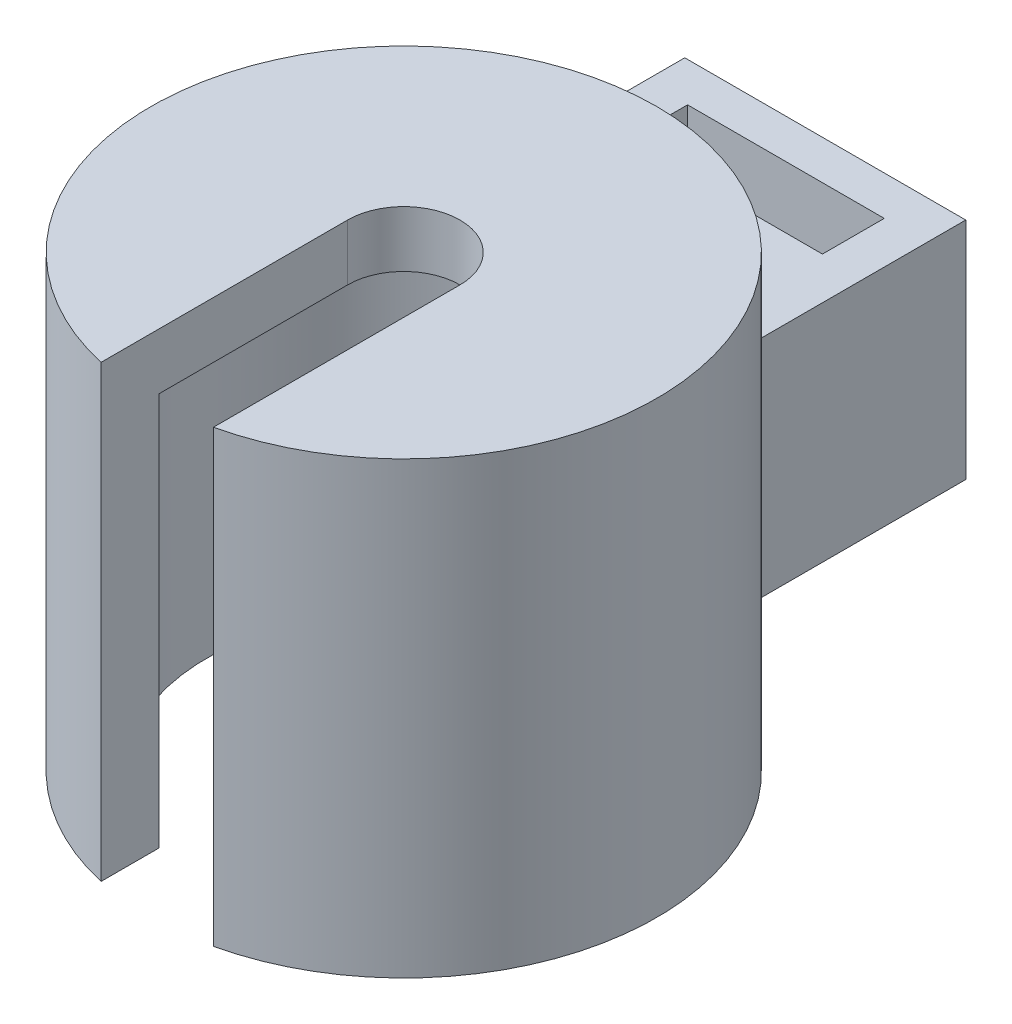
ISO-10303-21;
HEADER;
FILE_DESCRIPTION(('STEP AP214'),'2;1');
FILE_NAME('part.step','',(''),(''),'','','');
FILE_SCHEMA(('AUTOMOTIVE_DESIGN { 1 0 10303 214 1 1 1 1 }'));
ENDSEC;
DATA;
#1=APPLICATION_CONTEXT('core data for automotive mechanical design processes');
#2=APPLICATION_PROTOCOL_DEFINITION('international standard','automotive_design',2000,#1);
#3=PRODUCT_CONTEXT('',#1,'mechanical');
#4=PRODUCT('Part','Part','',(#3));
#5=PRODUCT_RELATED_PRODUCT_CATEGORY('part','',(#4));
#6=PRODUCT_DEFINITION_FORMATION('','',#4);
#7=PRODUCT_DEFINITION_CONTEXT('part definition',#1,'design');
#8=PRODUCT_DEFINITION('design','',#6,#7);
#9=PRODUCT_DEFINITION_SHAPE('','',#8);
#10=(LENGTH_UNIT() NAMED_UNIT(*) SI_UNIT(.MILLI.,.METRE.));
#11=(NAMED_UNIT(*) PLANE_ANGLE_UNIT() SI_UNIT($,.RADIAN.));
#12=(NAMED_UNIT(*) SI_UNIT($,.STERADIAN.) SOLID_ANGLE_UNIT());
#13=UNCERTAINTY_MEASURE_WITH_UNIT(LENGTH_MEASURE(1.E-05),#10,'distance_accuracy_value','');
#14=(GEOMETRIC_REPRESENTATION_CONTEXT(3) GLOBAL_UNCERTAINTY_ASSIGNED_CONTEXT((#13)) GLOBAL_UNIT_ASSIGNED_CONTEXT((#10,
#11,#12)) REPRESENTATION_CONTEXT('',''));
#15=CARTESIAN_POINT('',(0.,0.,0.));
#16=DIRECTION('',(0.,0.,1.));
#17=DIRECTION('',(1.,0.,0.));
#18=AXIS2_PLACEMENT_3D('',#15,#16,#17);
#19=CARTESIAN_POINT('',(0.,7.,0.));
#20=DIRECTION('',(0.,-1.,0.));
#21=DIRECTION('',(0.,0.,-1.));
#22=AXIS2_PLACEMENT_3D('',#19,#20,#21);
#23=CYLINDRICAL_SURFACE('',#22,4.5);
#24=CARTESIAN_POINT('',(0.,0.,0.));
#25=DIRECTION('',(0.,1.,0.));
#26=DIRECTION('',(0.,0.,1.));
#27=AXIS2_PLACEMENT_3D('',#24,#25,#26);
#28=CIRCLE('',#27,4.5);
#29=CARTESIAN_POINT('',(1.,0.,4.38748219369606));
#30=VERTEX_POINT('',#29);
#31=CARTESIAN_POINT('',(-1.,0.,4.38748219369606));
#32=VERTEX_POINT('',#31);
#33=EDGE_CURVE('E268',#30,#32,#28,.T.);
#34=ORIENTED_EDGE('',*,*,#33,.T.);
#35=DIRECTION('',(0.,-1.,0.));
#36=VECTOR('',#35,1.);
#37=CARTESIAN_POINT('',(-1.,7.,4.38748219369606));
#38=LINE('',#37,#36);
#39=CARTESIAN_POINT('',(-1.,8.,4.38748219369606));
#40=VERTEX_POINT('',#39);
#41=EDGE_CURVE('E284',#40,#32,#38,.T.);
#42=ORIENTED_EDGE('',*,*,#41,.F.);
#43=CARTESIAN_POINT('',(0.,8.,0.));
#44=DIRECTION('',(0.,1.,0.));
#45=DIRECTION('',(0.,0.,1.));
#46=AXIS2_PLACEMENT_3D('',#43,#44,#45);
#47=CIRCLE('',#46,4.5);
#48=CARTESIAN_POINT('',(1.,8.,4.38748219369606));
#49=VERTEX_POINT('',#48);
#50=EDGE_CURVE('E235',#49,#40,#47,.T.);
#51=ORIENTED_EDGE('',*,*,#50,.F.);
#52=DIRECTION('',(0.,-1.,0.));
#53=VECTOR('',#52,1.);
#54=CARTESIAN_POINT('',(1.,7.,4.38748219369606));
#55=LINE('',#54,#53);
#56=EDGE_CURVE('E287',#49,#30,#55,.T.);
#57=ORIENTED_EDGE('',*,*,#56,.T.);
#58=EDGE_LOOP('',(#34,#42,#51,#57));
#59=FACE_BOUND('',#58,.T.);
#60=DIRECTION('',(0.,-1.,0.));
#61=VECTOR('',#60,1.);
#62=CARTESIAN_POINT('',(-2.5,7.,-3.74165738677394));
#63=LINE('',#62,#61);
#64=CARTESIAN_POINT('',(-2.5,2.,-3.74165738677394));
#65=VERTEX_POINT('',#64);
#66=CARTESIAN_POINT('',(-2.5,6.,-3.74165738677394));
#67=VERTEX_POINT('',#66);
#68=EDGE_CURVE('E11',#65,#67,#63,.F.);
#69=ORIENTED_EDGE('',*,*,#68,.F.);
#70=CARTESIAN_POINT('',(0.,2.,0.));
#71=DIRECTION('',(0.,-1.,0.));
#72=DIRECTION('',(0.,0.,-1.));
#73=AXIS2_PLACEMENT_3D('',#70,#71,#72);
#74=CIRCLE('',#73,4.5);
#75=CARTESIAN_POINT('',(2.5,2.,-3.74165738677394));
#76=VERTEX_POINT('',#75);
#77=EDGE_CURVE('E221',#65,#76,#74,.T.);
#78=ORIENTED_EDGE('',*,*,#77,.T.);
#79=DIRECTION('',(0.,-1.,0.));
#80=VECTOR('',#79,1.);
#81=CARTESIAN_POINT('',(2.5,7.,-3.74165738677394));
#82=LINE('',#81,#80);
#83=CARTESIAN_POINT('',(2.5,6.,-3.74165738677394));
#84=VERTEX_POINT('',#83);
#85=EDGE_CURVE('E50',#76,#84,#82,.F.);
#86=ORIENTED_EDGE('',*,*,#85,.T.);
#87=CARTESIAN_POINT('',(0.,6.,0.));
#88=DIRECTION('',(0.,-1.,0.));
#89=DIRECTION('',(0.,0.,-1.));
#90=AXIS2_PLACEMENT_3D('',#87,#88,#89);
#91=CIRCLE('',#90,4.5);
#92=EDGE_CURVE('E214',#67,#84,#91,.T.);
#93=ORIENTED_EDGE('',*,*,#92,.F.);
#94=EDGE_LOOP('',(#69,#78,#86,#93));
#95=FACE_BOUND('',#94,.T.);
#96=ADVANCED_FACE('F41',(#59,#95),#23,.T.);
#97=CARTESIAN_POINT('',(1.,7.,0.));
#98=DIRECTION('',(1.,0.,0.));
#99=DIRECTION('',(0.,0.,-1.));
#100=AXIS2_PLACEMENT_3D('',#97,#98,#99);
#101=PLANE('',#100);
#102=DIRECTION('',(0.,0.,1.));
#103=VECTOR('',#102,1.);
#104=CARTESIAN_POINT('',(1.,0.,0.));
#105=LINE('',#104,#103);
#106=CARTESIAN_POINT('',(1.,0.,3.35410196624968));
#107=VERTEX_POINT('',#106);
#108=EDGE_CURVE('E258',#107,#30,#105,.T.);
#109=ORIENTED_EDGE('',*,*,#108,.T.);
#110=ORIENTED_EDGE('',*,*,#56,.F.);
#111=DIRECTION('',(0.,0.,1.));
#112=VECTOR('',#111,1.);
#113=CARTESIAN_POINT('',(1.,8.,0.));
#114=LINE('',#113,#112);
#115=CARTESIAN_POINT('',(1.,8.,0.));
#116=VERTEX_POINT('',#115);
#117=EDGE_CURVE('E230',#116,#49,#114,.T.);
#118=ORIENTED_EDGE('',*,*,#117,.F.);
#119=DIRECTION('',(0.,-1.,0.));
#120=VECTOR('',#119,1.);
#121=CARTESIAN_POINT('',(1.,8.,0.));
#122=LINE('',#121,#120);
#123=CARTESIAN_POINT('',(1.,7.,0.));
#124=VERTEX_POINT('',#123);
#125=EDGE_CURVE('E255',#116,#124,#122,.T.);
#126=ORIENTED_EDGE('',*,*,#125,.T.);
#127=DIRECTION('',(0.,0.,1.));
#128=VECTOR('',#127,1.);
#129=CARTESIAN_POINT('',(1.,7.,0.));
#130=LINE('',#129,#128);
#131=CARTESIAN_POINT('',(1.,7.,3.35410196624968));
#132=VERTEX_POINT('',#131);
#133=EDGE_CURVE('E247',#124,#132,#130,.T.);
#134=ORIENTED_EDGE('',*,*,#133,.T.);
#135=DIRECTION('',(0.,-1.,0.));
#136=VECTOR('',#135,1.);
#137=CARTESIAN_POINT('',(1.,7.,3.35410196624968));
#138=LINE('',#137,#136);
#139=EDGE_CURVE('E263',#132,#107,#138,.T.);
#140=ORIENTED_EDGE('',*,*,#139,.T.);
#141=EDGE_LOOP('',(#109,#110,#118,#126,#134,#140));
#142=FACE_BOUND('',#141,.T.);
#143=ADVANCED_FACE('F43',(#142),#101,.F.);
#144=CARTESIAN_POINT('',(-1.,7.,0.));
#145=DIRECTION('',(1.,0.,0.));
#146=DIRECTION('',(0.,0.,-1.));
#147=AXIS2_PLACEMENT_3D('',#144,#145,#146);
#148=PLANE('',#147);
#149=DIRECTION('',(0.,0.,1.));
#150=VECTOR('',#149,1.);
#151=CARTESIAN_POINT('',(-1.,0.,0.));
#152=LINE('',#151,#150);
#153=CARTESIAN_POINT('',(-1.,0.,3.35410196624968));
#154=VERTEX_POINT('',#153);
#155=EDGE_CURVE('E272',#154,#32,#152,.T.);
#156=ORIENTED_EDGE('',*,*,#155,.F.);
#157=DIRECTION('',(0.,-1.,0.));
#158=VECTOR('',#157,1.);
#159=CARTESIAN_POINT('',(-1.,7.,3.35410196624968));
#160=LINE('',#159,#158);
#161=CARTESIAN_POINT('',(-1.,7.,3.35410196624968));
#162=VERTEX_POINT('',#161);
#163=EDGE_CURVE('E281',#162,#154,#160,.T.);
#164=ORIENTED_EDGE('',*,*,#163,.F.);
#165=DIRECTION('',(0.,0.,1.));
#166=VECTOR('',#165,1.);
#167=CARTESIAN_POINT('',(-1.,7.,0.));
#168=LINE('',#167,#166);
#169=CARTESIAN_POINT('',(-1.,7.,0.));
#170=VERTEX_POINT('',#169);
#171=EDGE_CURVE('E231',#170,#162,#168,.T.);
#172=ORIENTED_EDGE('',*,*,#171,.F.);
#173=DIRECTION('',(0.,-1.,0.));
#174=VECTOR('',#173,1.);
#175=CARTESIAN_POINT('',(-1.,8.,0.));
#176=LINE('',#175,#174);
#177=CARTESIAN_POINT('',(-1.,8.,0.));
#178=VERTEX_POINT('',#177);
#179=EDGE_CURVE('E243',#178,#170,#176,.T.);
#180=ORIENTED_EDGE('',*,*,#179,.F.);
#181=DIRECTION('',(0.,0.,1.));
#182=VECTOR('',#181,1.);
#183=CARTESIAN_POINT('',(-1.,8.,0.));
#184=LINE('',#183,#182);
#185=EDGE_CURVE('E239',#178,#40,#184,.T.);
#186=ORIENTED_EDGE('',*,*,#185,.T.);
#187=ORIENTED_EDGE('',*,*,#41,.T.);
#188=EDGE_LOOP('',(#156,#164,#172,#180,#186,#187));
#189=FACE_BOUND('',#188,.T.);
#190=ADVANCED_FACE('F327',(#189),#148,.T.);
#191=CARTESIAN_POINT('',(0.,7.,0.));
#192=DIRECTION('',(0.,-1.,0.));
#193=DIRECTION('',(0.,0.,-1.));
#194=AXIS2_PLACEMENT_3D('',#191,#192,#193);
#195=CYLINDRICAL_SURFACE('',#194,3.5);
#196=CARTESIAN_POINT('',(0.,0.,0.));
#197=DIRECTION('',(0.,1.,0.));
#198=DIRECTION('',(0.,0.,1.));
#199=AXIS2_PLACEMENT_3D('',#196,#197,#198);
#200=CIRCLE('',#199,3.5);
#201=EDGE_CURVE('E264',#107,#154,#200,.T.);
#202=ORIENTED_EDGE('',*,*,#201,.F.);
#203=ORIENTED_EDGE('',*,*,#139,.F.);
#204=CARTESIAN_POINT('',(0.,7.,0.));
#205=DIRECTION('',(0.,1.,0.));
#206=DIRECTION('',(0.,0.,1.));
#207=AXIS2_PLACEMENT_3D('',#204,#205,#206);
#208=CIRCLE('',#207,3.5);
#209=EDGE_CURVE('E259',#132,#162,#208,.T.);
#210=ORIENTED_EDGE('',*,*,#209,.T.);
#211=ORIENTED_EDGE('',*,*,#163,.T.);
#212=EDGE_LOOP('',(#202,#203,#210,#211));
#213=FACE_BOUND('',#212,.T.);
#214=ADVANCED_FACE('F332',(#213),#195,.F.);
#215=CARTESIAN_POINT('',(0.,0.,0.));
#216=DIRECTION('',(0.,1.,0.));
#217=DIRECTION('',(0.,0.,1.));
#218=AXIS2_PLACEMENT_3D('',#215,#216,#217);
#219=PLANE('',#218);
#220=ORIENTED_EDGE('',*,*,#108,.F.);
#221=ORIENTED_EDGE('',*,*,#201,.T.);
#222=ORIENTED_EDGE('',*,*,#155,.T.);
#223=ORIENTED_EDGE('',*,*,#33,.F.);
#224=EDGE_LOOP('',(#220,#221,#222,#223));
#225=FACE_BOUND('',#224,.T.);
#226=ADVANCED_FACE('F336',(#225),#219,.F.);
#227=CARTESIAN_POINT('',(0.,7.,0.));
#228=DIRECTION('',(0.,1.,0.));
#229=DIRECTION('',(0.,0.,1.));
#230=AXIS2_PLACEMENT_3D('',#227,#228,#229);
#231=PLANE('',#230);
#232=ORIENTED_EDGE('',*,*,#209,.F.);
#233=ORIENTED_EDGE('',*,*,#133,.F.);
#234=CARTESIAN_POINT('',(0.,7.,0.));
#235=DIRECTION('',(0.,1.,0.));
#236=DIRECTION('',(0.,0.,1.));
#237=AXIS2_PLACEMENT_3D('',#234,#235,#236);
#238=CIRCLE('',#237,1.);
#239=EDGE_CURVE('E225',#124,#170,#238,.T.);
#240=ORIENTED_EDGE('',*,*,#239,.T.);
#241=ORIENTED_EDGE('',*,*,#171,.T.);
#242=EDGE_LOOP('',(#232,#233,#240,#241));
#243=FACE_BOUND('',#242,.T.);
#244=ADVANCED_FACE('F340',(#243),#231,.F.);
#245=CARTESIAN_POINT('',(0.,8.,0.));
#246=DIRECTION('',(0.,-1.,0.));
#247=DIRECTION('',(0.,0.,-1.));
#248=AXIS2_PLACEMENT_3D('',#245,#246,#247);
#249=CYLINDRICAL_SURFACE('',#248,1.);
#250=ORIENTED_EDGE('',*,*,#239,.F.);
#251=ORIENTED_EDGE('',*,*,#125,.F.);
#252=CARTESIAN_POINT('',(0.,8.,0.));
#253=DIRECTION('',(0.,1.,0.));
#254=DIRECTION('',(0.,0.,1.));
#255=AXIS2_PLACEMENT_3D('',#252,#253,#254);
#256=CIRCLE('',#255,1.);
#257=EDGE_CURVE('E226',#116,#178,#256,.T.);
#258=ORIENTED_EDGE('',*,*,#257,.T.);
#259=ORIENTED_EDGE('',*,*,#179,.T.);
#260=EDGE_LOOP('',(#250,#251,#258,#259));
#261=FACE_BOUND('',#260,.T.);
#262=ADVANCED_FACE('F318',(#261),#249,.F.);
#263=CARTESIAN_POINT('',(0.,8.,0.));
#264=DIRECTION('',(0.,1.,0.));
#265=DIRECTION('',(0.,0.,1.));
#266=AXIS2_PLACEMENT_3D('',#263,#264,#265);
#267=PLANE('',#266);
#268=ORIENTED_EDGE('',*,*,#257,.F.);
#269=ORIENTED_EDGE('',*,*,#117,.T.);
#270=ORIENTED_EDGE('',*,*,#50,.T.);
#271=ORIENTED_EDGE('',*,*,#185,.F.);
#272=EDGE_LOOP('',(#268,#269,#270,#271));
#273=FACE_BOUND('',#272,.T.);
#274=ADVANCED_FACE('F311',(#273),#267,.T.);
#275=CARTESIAN_POINT('',(-2.5,0.,0.));
#276=DIRECTION('',(1.,0.,0.));
#277=DIRECTION('',(0.,0.,-1.));
#278=AXIS2_PLACEMENT_3D('',#275,#276,#277);
#279=PLANE('',#278);
#280=DIRECTION('',(0.,0.,-1.));
#281=VECTOR('',#280,1.);
#282=CARTESIAN_POINT('',(-2.5,2.,0.));
#283=LINE('',#282,#281);
#284=CARTESIAN_POINT('',(-2.5,2.,-7.5));
#285=VERTEX_POINT('',#284);
#286=EDGE_CURVE('E206',#65,#285,#283,.T.);
#287=ORIENTED_EDGE('',*,*,#286,.F.);
#288=ORIENTED_EDGE('',*,*,#68,.T.);
#289=DIRECTION('',(0.,0.,-1.));
#290=VECTOR('',#289,1.);
#291=CARTESIAN_POINT('',(-2.5,6.,0.));
#292=LINE('',#291,#290);
#293=CARTESIAN_POINT('',(-2.5,6.,-7.5));
#294=VERTEX_POINT('',#293);
#295=EDGE_CURVE('E203',#67,#294,#292,.T.);
#296=ORIENTED_EDGE('',*,*,#295,.T.);
#297=DIRECTION('',(0.,-1.,0.));
#298=VECTOR('',#297,1.);
#299=CARTESIAN_POINT('',(-2.5,0.,-7.5));
#300=LINE('',#299,#298);
#301=EDGE_CURVE('E199',#294,#285,#300,.T.);
#302=ORIENTED_EDGE('',*,*,#301,.T.);
#303=EDGE_LOOP('',(#287,#288,#296,#302));
#304=FACE_BOUND('',#303,.T.);
#305=ADVANCED_FACE('F309',(#304),#279,.F.);
#306=CARTESIAN_POINT('',(2.5,0.,0.));
#307=DIRECTION('',(1.,0.,0.));
#308=DIRECTION('',(0.,0.,-1.));
#309=AXIS2_PLACEMENT_3D('',#306,#307,#308);
#310=PLANE('',#309);
#311=ORIENTED_EDGE('',*,*,#85,.F.);
#312=DIRECTION('',(0.,0.,-1.));
#313=VECTOR('',#312,1.);
#314=CARTESIAN_POINT('',(2.5,2.,0.));
#315=LINE('',#314,#313);
#316=CARTESIAN_POINT('',(2.5,2.,-7.5));
#317=VERTEX_POINT('',#316);
#318=EDGE_CURVE('E196',#76,#317,#315,.T.);
#319=ORIENTED_EDGE('',*,*,#318,.T.);
#320=DIRECTION('',(0.,-1.,0.));
#321=VECTOR('',#320,1.);
#322=CARTESIAN_POINT('',(2.5,0.,-7.5));
#323=LINE('',#322,#321);
#324=CARTESIAN_POINT('',(2.5,6.,-7.5));
#325=VERTEX_POINT('',#324);
#326=EDGE_CURVE('E189',#325,#317,#323,.T.);
#327=ORIENTED_EDGE('',*,*,#326,.F.);
#328=DIRECTION('',(0.,0.,-1.));
#329=VECTOR('',#328,1.);
#330=CARTESIAN_POINT('',(2.5,6.,0.));
#331=LINE('',#330,#329);
#332=EDGE_CURVE('E193',#84,#325,#331,.T.);
#333=ORIENTED_EDGE('',*,*,#332,.F.);
#334=EDGE_LOOP('',(#311,#319,#327,#333));
#335=FACE_BOUND('',#334,.T.);
#336=ADVANCED_FACE('F297',(#335),#310,.T.);
#337=CARTESIAN_POINT('',(-2.5,0.,-7.5));
#338=DIRECTION('',(0.,0.,1.));
#339=DIRECTION('',(0.,-1.,0.));
#340=AXIS2_PLACEMENT_3D('',#337,#338,#339);
#341=PLANE('',#340);
#342=DIRECTION('',(1.,0.,0.));
#343=VECTOR('',#342,1.);
#344=CARTESIAN_POINT('',(-2.5,6.,-7.5));
#345=LINE('',#344,#343);
#346=EDGE_CURVE('E209',#294,#325,#345,.T.);
#347=ORIENTED_EDGE('',*,*,#346,.T.);
#348=ORIENTED_EDGE('',*,*,#326,.T.);
#349=DIRECTION('',(1.,0.,0.));
#350=VECTOR('',#349,1.);
#351=CARTESIAN_POINT('',(-2.5,2.,-7.5));
#352=LINE('',#351,#350);
#353=EDGE_CURVE('E210',#285,#317,#352,.T.);
#354=ORIENTED_EDGE('',*,*,#353,.F.);
#355=ORIENTED_EDGE('',*,*,#301,.F.);
#356=EDGE_LOOP('',(#347,#348,#354,#355));
#357=FACE_BOUND('',#356,.T.);
#358=ADVANCED_FACE('F305',(#357),#341,.F.);
#359=CARTESIAN_POINT('',(-2.5,2.,0.));
#360=DIRECTION('',(0.,-1.,0.));
#361=DIRECTION('',(0.,0.,-1.));
#362=AXIS2_PLACEMENT_3D('',#359,#360,#361);
#363=PLANE('',#362);
#364=DIRECTION('',(1.,0.,0.));
#365=VECTOR('',#364,1.);
#366=CARTESIAN_POINT('',(-2.5,2.,-6.80000000000001));
#367=LINE('',#366,#365);
#368=CARTESIAN_POINT('',(-1.75,2.,-6.80000000000001));
#369=VERTEX_POINT('',#368);
#370=CARTESIAN_POINT('',(1.75,2.,-6.80000000000001));
#371=VERTEX_POINT('',#370);
#372=EDGE_CURVE('E186',#369,#371,#367,.T.);
#373=ORIENTED_EDGE('',*,*,#372,.F.);
#374=DIRECTION('',(0.,0.,-1.));
#375=VECTOR('',#374,1.);
#376=CARTESIAN_POINT('',(-1.75,2.,0.));
#377=LINE('',#376,#375);
#378=CARTESIAN_POINT('',(-1.75,2.,-5.70000000000001));
#379=VERTEX_POINT('',#378);
#380=EDGE_CURVE('E173',#379,#369,#377,.T.);
#381=ORIENTED_EDGE('',*,*,#380,.F.);
#382=DIRECTION('',(1.,0.,0.));
#383=VECTOR('',#382,1.);
#384=CARTESIAN_POINT('',(-2.5,2.,-5.70000000000001));
#385=LINE('',#384,#383);
#386=CARTESIAN_POINT('',(1.75,2.,-5.70000000000001));
#387=VERTEX_POINT('',#386);
#388=EDGE_CURVE('E148',#379,#387,#385,.T.);
#389=ORIENTED_EDGE('',*,*,#388,.T.);
#390=DIRECTION('',(0.,0.,-1.));
#391=VECTOR('',#390,1.);
#392=CARTESIAN_POINT('',(1.75,2.,0.));
#393=LINE('',#392,#391);
#394=EDGE_CURVE('E182',#387,#371,#393,.T.);
#395=ORIENTED_EDGE('',*,*,#394,.T.);
#396=EDGE_LOOP('',(#373,#381,#389,#395));
#397=FACE_BOUND('',#396,.T.);
#398=ORIENTED_EDGE('',*,*,#77,.F.);
#399=ORIENTED_EDGE('',*,*,#286,.T.);
#400=ORIENTED_EDGE('',*,*,#353,.T.);
#401=ORIENTED_EDGE('',*,*,#318,.F.);
#402=EDGE_LOOP('',(#398,#399,#400,#401));
#403=FACE_BOUND('',#402,.T.);
#404=ADVANCED_FACE('F300',(#397,#403),#363,.T.);
#405=CARTESIAN_POINT('',(-2.5,6.,0.));
#406=DIRECTION('',(0.,-1.,0.));
#407=DIRECTION('',(0.,0.,-1.));
#408=AXIS2_PLACEMENT_3D('',#405,#406,#407);
#409=PLANE('',#408);
#410=DIRECTION('',(0.,0.,1.));
#411=VECTOR('',#410,1.);
#412=CARTESIAN_POINT('',(-1.75,6.,0.));
#413=LINE('',#412,#411);
#414=CARTESIAN_POINT('',(-1.75,6.,-6.80000000000001));
#415=VERTEX_POINT('',#414);
#416=CARTESIAN_POINT('',(-1.75,6.,-5.70000000000001));
#417=VERTEX_POINT('',#416);
#418=EDGE_CURVE('E155',#415,#417,#413,.T.);
#419=ORIENTED_EDGE('',*,*,#418,.F.);
#420=DIRECTION('',(-1.,0.,0.));
#421=VECTOR('',#420,1.);
#422=CARTESIAN_POINT('',(0.,6.,-6.80000000000001));
#423=LINE('',#422,#421);
#424=CARTESIAN_POINT('',(1.75,6.,-6.80000000000001));
#425=VERTEX_POINT('',#424);
#426=EDGE_CURVE('E65',#425,#415,#423,.T.);
#427=ORIENTED_EDGE('',*,*,#426,.F.);
#428=DIRECTION('',(0.,0.,1.));
#429=VECTOR('',#428,1.);
#430=CARTESIAN_POINT('',(1.75,6.,0.));
#431=LINE('',#430,#429);
#432=CARTESIAN_POINT('',(1.75,6.,-5.70000000000001));
#433=VERTEX_POINT('',#432);
#434=EDGE_CURVE('E163',#425,#433,#431,.T.);
#435=ORIENTED_EDGE('',*,*,#434,.T.);
#436=DIRECTION('',(-1.,0.,0.));
#437=VECTOR('',#436,1.);
#438=CARTESIAN_POINT('',(0.,6.,-5.70000000000001));
#439=LINE('',#438,#437);
#440=EDGE_CURVE('E145',#433,#417,#439,.T.);
#441=ORIENTED_EDGE('',*,*,#440,.T.);
#442=EDGE_LOOP('',(#419,#427,#435,#441));
#443=FACE_BOUND('',#442,.T.);
#444=ORIENTED_EDGE('',*,*,#295,.F.);
#445=ORIENTED_EDGE('',*,*,#92,.T.);
#446=ORIENTED_EDGE('',*,*,#332,.T.);
#447=ORIENTED_EDGE('',*,*,#346,.F.);
#448=EDGE_LOOP('',(#444,#445,#446,#447));
#449=FACE_BOUND('',#448,.T.);
#450=ADVANCED_FACE('F160',(#443,#449),#409,.F.);
#451=CARTESIAN_POINT('',(0.,-1.,-6.80000000000001));
#452=DIRECTION('',(0.,0.,-1.));
#453=DIRECTION('',(-1.,0.,0.));
#454=AXIS2_PLACEMENT_3D('',#451,#452,#453);
#455=PLANE('',#454);
#456=ORIENTED_EDGE('',*,*,#372,.T.);
#457=DIRECTION('',(0.,1.,0.));
#458=VECTOR('',#457,1.);
#459=CARTESIAN_POINT('',(1.75,-1.,-6.80000000000001));
#460=LINE('',#459,#458);
#461=EDGE_CURVE('E170',#371,#425,#460,.T.);
#462=ORIENTED_EDGE('',*,*,#461,.T.);
#463=ORIENTED_EDGE('',*,*,#426,.T.);
#464=DIRECTION('',(0.,1.,0.));
#465=VECTOR('',#464,1.);
#466=CARTESIAN_POINT('',(-1.75,-1.,-6.80000000000001));
#467=LINE('',#466,#465);
#468=EDGE_CURVE('E152',#369,#415,#467,.T.);
#469=ORIENTED_EDGE('',*,*,#468,.F.);
#470=EDGE_LOOP('',(#456,#462,#463,#469));
#471=FACE_BOUND('',#470,.T.);
#472=ADVANCED_FACE('F351',(#471),#455,.F.);
#473=CARTESIAN_POINT('',(1.75,-1.,0.));
#474=DIRECTION('',(-1.,0.,0.));
#475=DIRECTION('',(0.,0.,1.));
#476=AXIS2_PLACEMENT_3D('',#473,#474,#475);
#477=PLANE('',#476);
#478=DIRECTION('',(0.,1.,0.));
#479=VECTOR('',#478,1.);
#480=CARTESIAN_POINT('',(1.75,-1.,-5.70000000000001));
#481=LINE('',#480,#479);
#482=EDGE_CURVE('E151',#387,#433,#481,.T.);
#483=ORIENTED_EDGE('',*,*,#482,.T.);
#484=ORIENTED_EDGE('',*,*,#434,.F.);
#485=ORIENTED_EDGE('',*,*,#461,.F.);
#486=ORIENTED_EDGE('',*,*,#394,.F.);
#487=EDGE_LOOP('',(#483,#484,#485,#486));
#488=FACE_BOUND('',#487,.T.);
#489=ADVANCED_FACE('F359',(#488),#477,.T.);
#490=CARTESIAN_POINT('',(0.,-1.,-5.70000000000001));
#491=DIRECTION('',(0.,0.,-1.));
#492=DIRECTION('',(-1.,0.,0.));
#493=AXIS2_PLACEMENT_3D('',#490,#491,#492);
#494=PLANE('',#493);
#495=DIRECTION('',(0.,1.,0.));
#496=VECTOR('',#495,1.);
#497=CARTESIAN_POINT('',(-1.75,-1.,-5.70000000000001));
#498=LINE('',#497,#496);
#499=EDGE_CURVE('E57',#379,#417,#498,.T.);
#500=ORIENTED_EDGE('',*,*,#499,.T.);
#501=ORIENTED_EDGE('',*,*,#440,.F.);
#502=ORIENTED_EDGE('',*,*,#482,.F.);
#503=ORIENTED_EDGE('',*,*,#388,.F.);
#504=EDGE_LOOP('',(#500,#501,#502,#503));
#505=FACE_BOUND('',#504,.T.);
#506=ADVANCED_FACE('F142',(#505),#494,.T.);
#507=CARTESIAN_POINT('',(-1.75,-1.,0.));
#508=DIRECTION('',(-1.,0.,0.));
#509=DIRECTION('',(0.,0.,1.));
#510=AXIS2_PLACEMENT_3D('',#507,#508,#509);
#511=PLANE('',#510);
#512=ORIENTED_EDGE('',*,*,#380,.T.);
#513=ORIENTED_EDGE('',*,*,#468,.T.);
#514=ORIENTED_EDGE('',*,*,#418,.T.);
#515=ORIENTED_EDGE('',*,*,#499,.F.);
#516=EDGE_LOOP('',(#512,#513,#514,#515));
#517=FACE_BOUND('',#516,.T.);
#518=ADVANCED_FACE('F156',(#517),#511,.F.);
#519=CLOSED_SHELL('',(#96,#143,#190,#214,#226,#244,#262,#274,#305,#336,#358,#404,#450,#472,#489,
#506,#518));
#520=MANIFOLD_SOLID_BREP('B2',#519);
#521=ADVANCED_BREP_SHAPE_REPRESENTATION('',(#18,#520),#14);
#522=SHAPE_DEFINITION_REPRESENTATION(#9,#521);
ENDSEC;
END-ISO-10303-21;
